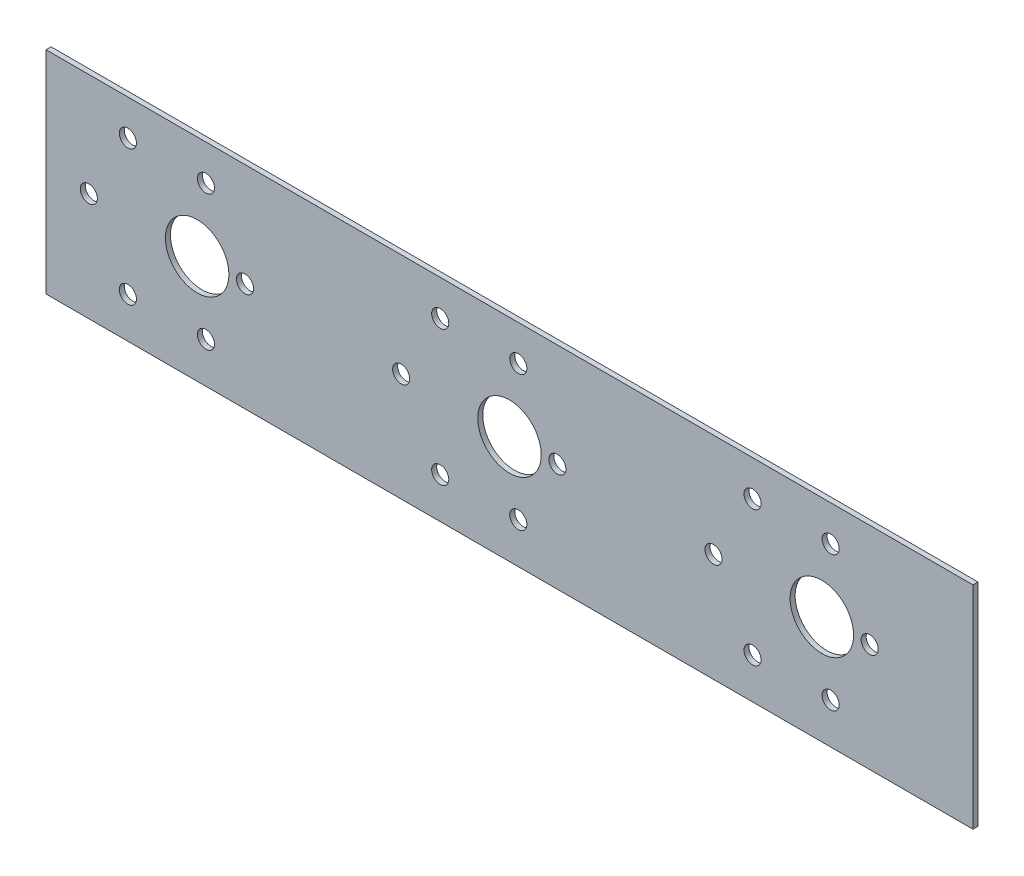
ISO-10303-21;
HEADER;
FILE_DESCRIPTION(('STEP AP214'),'2;1');
FILE_NAME('part.step','',(''),(''),'','','');
FILE_SCHEMA(('AUTOMOTIVE_DESIGN { 1 0 10303 214 1 1 1 1 }'));
ENDSEC;
DATA;
#1=APPLICATION_CONTEXT('core data for automotive mechanical design processes');
#2=APPLICATION_PROTOCOL_DEFINITION('international standard','automotive_design',2000,#1);
#3=PRODUCT_CONTEXT('',#1,'mechanical');
#4=PRODUCT('Part','Part','',(#3));
#5=PRODUCT_RELATED_PRODUCT_CATEGORY('part','',(#4));
#6=PRODUCT_DEFINITION_FORMATION('','',#4);
#7=PRODUCT_DEFINITION_CONTEXT('part definition',#1,'design');
#8=PRODUCT_DEFINITION('design','',#6,#7);
#9=PRODUCT_DEFINITION_SHAPE('','',#8);
#10=(LENGTH_UNIT() NAMED_UNIT(*) SI_UNIT(.MILLI.,.METRE.));
#11=(NAMED_UNIT(*) PLANE_ANGLE_UNIT() SI_UNIT($,.RADIAN.));
#12=(NAMED_UNIT(*) SI_UNIT($,.STERADIAN.) SOLID_ANGLE_UNIT());
#13=UNCERTAINTY_MEASURE_WITH_UNIT(LENGTH_MEASURE(1.E-05),#10,'distance_accuracy_value','');
#14=(GEOMETRIC_REPRESENTATION_CONTEXT(3) GLOBAL_UNCERTAINTY_ASSIGNED_CONTEXT((#13)) GLOBAL_UNIT_ASSIGNED_CONTEXT((#10,
#11,#12)) REPRESENTATION_CONTEXT('',''));
#15=CARTESIAN_POINT('',(0.,0.,0.));
#16=DIRECTION('',(0.,0.,1.));
#17=DIRECTION('',(1.,0.,0.));
#18=AXIS2_PLACEMENT_3D('',#15,#16,#17);
#19=CARTESIAN_POINT('',(0.,0.,1.));
#20=DIRECTION('',(0.,0.,1.));
#21=DIRECTION('',(1.,0.,0.));
#22=AXIS2_PLACEMENT_3D('',#19,#20,#21);
#23=PLANE('',#22);
#24=CARTESIAN_POINT('',(48.25,15.076606241,1.));
#25=DIRECTION('',(0.,0.,1.));
#26=DIRECTION('',(1.,0.,0.));
#27=AXIS2_PLACEMENT_3D('',#24,#25,#26);
#28=CIRCLE('',#27,1.7);
#29=CARTESIAN_POINT('',(49.95,15.076606241,1.));
#30=VERTEX_POINT('',#29);
#31=EDGE_CURVE('E229',#30,#30,#28,.T.);
#32=ORIENTED_EDGE('',*,*,#31,.F.);
#33=EDGE_LOOP('',(#32));
#34=FACE_BOUND('',#33,.T.);
#35=CARTESIAN_POINT('',(48.25,41.923393759,1.));
#36=DIRECTION('',(0.,0.,1.));
#37=DIRECTION('',(1.,0.,0.));
#38=AXIS2_PLACEMENT_3D('',#35,#36,#37);
#39=CIRCLE('',#38,1.7);
#40=CARTESIAN_POINT('',(49.95,41.923393759,1.));
#41=VERTEX_POINT('',#40);
#42=EDGE_CURVE('E217',#41,#41,#39,.T.);
#43=ORIENTED_EDGE('',*,*,#42,.F.);
#44=EDGE_LOOP('',(#43));
#45=FACE_BOUND('',#44,.T.);
#46=CARTESIAN_POINT('',(71.5,28.5,1.));
#47=DIRECTION('',(0.,0.,1.));
#48=DIRECTION('',(1.,0.,0.));
#49=AXIS2_PLACEMENT_3D('',#46,#47,#48);
#50=CIRCLE('',#49,1.69999999999999);
#51=CARTESIAN_POINT('',(73.2,28.5,1.));
#52=VERTEX_POINT('',#51);
#53=EDGE_CURVE('E205',#52,#52,#50,.T.);
#54=ORIENTED_EDGE('',*,*,#53,.F.);
#55=EDGE_LOOP('',(#54));
#56=FACE_BOUND('',#55,.T.);
#57=CARTESIAN_POINT('',(-13.75,15.076606241,1.));
#58=DIRECTION('',(0.,0.,1.));
#59=DIRECTION('',(1.,0.,0.));
#60=AXIS2_PLACEMENT_3D('',#57,#58,#59);
#61=CIRCLE('',#60,1.7);
#62=CARTESIAN_POINT('',(-12.05,15.076606241,1.));
#63=VERTEX_POINT('',#62);
#64=EDGE_CURVE('E193',#63,#63,#61,.T.);
#65=ORIENTED_EDGE('',*,*,#64,.F.);
#66=EDGE_LOOP('',(#65));
#67=FACE_BOUND('',#66,.T.);
#68=CARTESIAN_POINT('',(-13.75,41.923393759,1.));
#69=DIRECTION('',(0.,0.,1.));
#70=DIRECTION('',(1.,0.,0.));
#71=AXIS2_PLACEMENT_3D('',#68,#69,#70);
#72=CIRCLE('',#71,1.7);
#73=CARTESIAN_POINT('',(-12.05,41.923393759,1.));
#74=VERTEX_POINT('',#73);
#75=EDGE_CURVE('E181',#74,#74,#72,.T.);
#76=ORIENTED_EDGE('',*,*,#75,.F.);
#77=EDGE_LOOP('',(#76));
#78=FACE_BOUND('',#77,.T.);
#79=CARTESIAN_POINT('',(9.5,28.5,1.));
#80=DIRECTION('',(0.,0.,1.));
#81=DIRECTION('',(1.,0.,0.));
#82=AXIS2_PLACEMENT_3D('',#79,#80,#81);
#83=CIRCLE('',#82,1.7);
#84=CARTESIAN_POINT('',(11.2,28.5,1.));
#85=VERTEX_POINT('',#84);
#86=EDGE_CURVE('E169',#85,#85,#83,.T.);
#87=ORIENTED_EDGE('',*,*,#86,.F.);
#88=EDGE_LOOP('',(#87));
#89=FACE_BOUND('',#88,.T.);
#90=CARTESIAN_POINT('',(-75.75,15.076606241,1.));
#91=DIRECTION('',(0.,0.,1.));
#92=DIRECTION('',(1.,0.,0.));
#93=AXIS2_PLACEMENT_3D('',#90,#91,#92);
#94=CIRCLE('',#93,1.69999999999999);
#95=CARTESIAN_POINT('',(-74.05,15.076606241,1.));
#96=VERTEX_POINT('',#95);
#97=EDGE_CURVE('E157',#96,#96,#94,.T.);
#98=ORIENTED_EDGE('',*,*,#97,.F.);
#99=EDGE_LOOP('',(#98));
#100=FACE_BOUND('',#99,.T.);
#101=CARTESIAN_POINT('',(-75.75,41.923393759,1.));
#102=DIRECTION('',(0.,0.,1.));
#103=DIRECTION('',(1.,0.,0.));
#104=AXIS2_PLACEMENT_3D('',#101,#102,#103);
#105=CIRCLE('',#104,1.69999999999999);
#106=CARTESIAN_POINT('',(-74.05,41.923393759,1.));
#107=VERTEX_POINT('',#106);
#108=EDGE_CURVE('E145',#107,#107,#105,.T.);
#109=ORIENTED_EDGE('',*,*,#108,.F.);
#110=EDGE_LOOP('',(#109));
#111=FACE_BOUND('',#110,.T.);
#112=CARTESIAN_POINT('',(-52.5,28.5,1.));
#113=DIRECTION('',(0.,0.,1.));
#114=DIRECTION('',(1.,0.,0.));
#115=AXIS2_PLACEMENT_3D('',#112,#113,#114);
#116=CIRCLE('',#115,1.7);
#117=CARTESIAN_POINT('',(-50.8,28.5,1.));
#118=VERTEX_POINT('',#117);
#119=EDGE_CURVE('E133',#118,#118,#116,.T.);
#120=ORIENTED_EDGE('',*,*,#119,.F.);
#121=EDGE_LOOP('',(#120));
#122=FACE_BOUND('',#121,.T.);
#123=CARTESIAN_POINT('',(0.,28.5,1.));
#124=DIRECTION('',(0.,0.,1.));
#125=DIRECTION('',(1.,0.,0.));
#126=AXIS2_PLACEMENT_3D('',#123,#124,#125);
#127=CIRCLE('',#126,6.3);
#128=CARTESIAN_POINT('',(6.3,28.5,1.));
#129=VERTEX_POINT('',#128);
#130=EDGE_CURVE('E121',#129,#129,#127,.T.);
#131=ORIENTED_EDGE('',*,*,#130,.F.);
#132=EDGE_LOOP('',(#131));
#133=FACE_BOUND('',#132,.T.);
#134=DIRECTION('',(0.,-1.,0.));
#135=VECTOR('',#134,1.);
#136=CARTESIAN_POINT('',(-92.,49.,1.));
#137=LINE('',#136,#135);
#138=CARTESIAN_POINT('',(-92.,49.,1.));
#139=VERTEX_POINT('',#138);
#140=CARTESIAN_POINT('',(-92.,7.,1.));
#141=VERTEX_POINT('',#140);
#142=EDGE_CURVE('E91',#139,#141,#137,.T.);
#143=ORIENTED_EDGE('',*,*,#142,.T.);
#144=DIRECTION('',(1.,0.,0.));
#145=VECTOR('',#144,1.);
#146=CARTESIAN_POINT('',(-92.,7.,1.));
#147=LINE('',#146,#145);
#148=CARTESIAN_POINT('',(92.,7.,1.));
#149=VERTEX_POINT('',#148);
#150=EDGE_CURVE('E86',#141,#149,#147,.T.);
#151=ORIENTED_EDGE('',*,*,#150,.T.);
#152=DIRECTION('',(0.,1.,0.));
#153=VECTOR('',#152,1.);
#154=CARTESIAN_POINT('',(92.,7.,1.));
#155=LINE('',#154,#153);
#156=CARTESIAN_POINT('',(92.,49.,1.));
#157=VERTEX_POINT('',#156);
#158=EDGE_CURVE('E89',#149,#157,#155,.T.);
#159=ORIENTED_EDGE('',*,*,#158,.T.);
#160=DIRECTION('',(-1.,0.,0.));
#161=VECTOR('',#160,1.);
#162=CARTESIAN_POINT('',(92.,49.,1.));
#163=LINE('',#162,#161);
#164=EDGE_CURVE('E56',#157,#139,#163,.T.);
#165=ORIENTED_EDGE('',*,*,#164,.T.);
#166=EDGE_LOOP('',(#143,#151,#159,#165));
#167=FACE_BOUND('',#166,.T.);
#168=CARTESIAN_POINT('',(-62.,28.5,1.));
#169=DIRECTION('',(0.,0.,1.));
#170=DIRECTION('',(1.,0.,0.));
#171=AXIS2_PLACEMENT_3D('',#168,#169,#170);
#172=CIRCLE('',#171,6.3);
#173=CARTESIAN_POINT('',(-55.7,28.5,1.));
#174=VERTEX_POINT('',#173);
#175=EDGE_CURVE('E106',#174,#174,#172,.T.);
#176=ORIENTED_EDGE('',*,*,#175,.F.);
#177=EDGE_LOOP('',(#176));
#178=FACE_BOUND('',#177,.T.);
#179=CARTESIAN_POINT('',(62.,28.5,1.));
#180=DIRECTION('',(0.,0.,1.));
#181=DIRECTION('',(1.,0.,0.));
#182=AXIS2_PLACEMENT_3D('',#179,#180,#181);
#183=CIRCLE('',#182,6.3);
#184=CARTESIAN_POINT('',(68.3,28.5,1.));
#185=VERTEX_POINT('',#184);
#186=EDGE_CURVE('E127',#185,#185,#183,.T.);
#187=ORIENTED_EDGE('',*,*,#186,.F.);
#188=EDGE_LOOP('',(#187));
#189=FACE_BOUND('',#188,.T.);
#190=CARTESIAN_POINT('',(-60.25,41.923393759,1.));
#191=DIRECTION('',(0.,0.,1.));
#192=DIRECTION('',(1.,0.,0.));
#193=AXIS2_PLACEMENT_3D('',#190,#191,#192);
#194=CIRCLE('',#193,1.7);
#195=CARTESIAN_POINT('',(-58.55,41.923393759,1.));
#196=VERTEX_POINT('',#195);
#197=EDGE_CURVE('E139',#196,#196,#194,.T.);
#198=ORIENTED_EDGE('',*,*,#197,.F.);
#199=EDGE_LOOP('',(#198));
#200=FACE_BOUND('',#199,.T.);
#201=CARTESIAN_POINT('',(-83.5,28.5,1.));
#202=DIRECTION('',(0.,0.,1.));
#203=DIRECTION('',(1.,0.,0.));
#204=AXIS2_PLACEMENT_3D('',#201,#202,#203);
#205=CIRCLE('',#204,1.69999999999999);
#206=CARTESIAN_POINT('',(-81.8,28.5,1.));
#207=VERTEX_POINT('',#206);
#208=EDGE_CURVE('E151',#207,#207,#205,.T.);
#209=ORIENTED_EDGE('',*,*,#208,.F.);
#210=EDGE_LOOP('',(#209));
#211=FACE_BOUND('',#210,.T.);
#212=CARTESIAN_POINT('',(-60.25,15.076606241,1.));
#213=DIRECTION('',(0.,0.,1.));
#214=DIRECTION('',(1.,0.,0.));
#215=AXIS2_PLACEMENT_3D('',#212,#213,#214);
#216=CIRCLE('',#215,1.7);
#217=CARTESIAN_POINT('',(-58.55,15.076606241,1.));
#218=VERTEX_POINT('',#217);
#219=EDGE_CURVE('E163',#218,#218,#216,.T.);
#220=ORIENTED_EDGE('',*,*,#219,.F.);
#221=EDGE_LOOP('',(#220));
#222=FACE_BOUND('',#221,.T.);
#223=CARTESIAN_POINT('',(1.75,41.923393759,1.));
#224=DIRECTION('',(0.,0.,1.));
#225=DIRECTION('',(1.,0.,0.));
#226=AXIS2_PLACEMENT_3D('',#223,#224,#225);
#227=CIRCLE('',#226,1.7);
#228=CARTESIAN_POINT('',(3.45,41.923393759,1.));
#229=VERTEX_POINT('',#228);
#230=EDGE_CURVE('E175',#229,#229,#227,.T.);
#231=ORIENTED_EDGE('',*,*,#230,.F.);
#232=EDGE_LOOP('',(#231));
#233=FACE_BOUND('',#232,.T.);
#234=CARTESIAN_POINT('',(-21.5,28.5,1.));
#235=DIRECTION('',(0.,0.,1.));
#236=DIRECTION('',(1.,0.,0.));
#237=AXIS2_PLACEMENT_3D('',#234,#235,#236);
#238=CIRCLE('',#237,1.7);
#239=CARTESIAN_POINT('',(-19.8,28.5,1.));
#240=VERTEX_POINT('',#239);
#241=EDGE_CURVE('E187',#240,#240,#238,.T.);
#242=ORIENTED_EDGE('',*,*,#241,.F.);
#243=EDGE_LOOP('',(#242));
#244=FACE_BOUND('',#243,.T.);
#245=CARTESIAN_POINT('',(1.75,15.076606241,1.));
#246=DIRECTION('',(0.,0.,1.));
#247=DIRECTION('',(1.,0.,0.));
#248=AXIS2_PLACEMENT_3D('',#245,#246,#247);
#249=CIRCLE('',#248,1.7);
#250=CARTESIAN_POINT('',(3.45,15.076606241,1.));
#251=VERTEX_POINT('',#250);
#252=EDGE_CURVE('E199',#251,#251,#249,.T.);
#253=ORIENTED_EDGE('',*,*,#252,.F.);
#254=EDGE_LOOP('',(#253));
#255=FACE_BOUND('',#254,.T.);
#256=CARTESIAN_POINT('',(63.75,41.923393759,1.));
#257=DIRECTION('',(0.,0.,1.));
#258=DIRECTION('',(1.,0.,0.));
#259=AXIS2_PLACEMENT_3D('',#256,#257,#258);
#260=CIRCLE('',#259,1.69999999999999);
#261=CARTESIAN_POINT('',(65.45,41.923393759,1.));
#262=VERTEX_POINT('',#261);
#263=EDGE_CURVE('E211',#262,#262,#260,.T.);
#264=ORIENTED_EDGE('',*,*,#263,.F.);
#265=EDGE_LOOP('',(#264));
#266=FACE_BOUND('',#265,.T.);
#267=CARTESIAN_POINT('',(40.5,28.5,1.));
#268=DIRECTION('',(0.,0.,1.));
#269=DIRECTION('',(1.,0.,0.));
#270=AXIS2_PLACEMENT_3D('',#267,#268,#269);
#271=CIRCLE('',#270,1.7);
#272=CARTESIAN_POINT('',(42.2,28.5,1.));
#273=VERTEX_POINT('',#272);
#274=EDGE_CURVE('E223',#273,#273,#271,.T.);
#275=ORIENTED_EDGE('',*,*,#274,.F.);
#276=EDGE_LOOP('',(#275));
#277=FACE_BOUND('',#276,.T.);
#278=CARTESIAN_POINT('',(63.75,15.076606241,1.));
#279=DIRECTION('',(0.,0.,1.));
#280=DIRECTION('',(1.,0.,0.));
#281=AXIS2_PLACEMENT_3D('',#278,#279,#280);
#282=CIRCLE('',#281,1.69999999999999);
#283=CARTESIAN_POINT('',(65.45,15.076606241,1.));
#284=VERTEX_POINT('',#283);
#285=EDGE_CURVE('E235',#284,#284,#282,.T.);
#286=ORIENTED_EDGE('',*,*,#285,.F.);
#287=EDGE_LOOP('',(#286));
#288=FACE_BOUND('',#287,.T.);
#289=ADVANCED_FACE('F39',(#34,#45,#56,#67,#78,#89,#100,#111,#122,#133,#167,#178,#189,#200,#211,
#222,#233,#244,#255,#266,#277,#288),#23,.T.);
#290=CARTESIAN_POINT('',(0.,0.,0.));
#291=DIRECTION('',(0.,0.,1.));
#292=DIRECTION('',(1.,0.,0.));
#293=AXIS2_PLACEMENT_3D('',#290,#291,#292);
#294=PLANE('',#293);
#295=DIRECTION('',(0.,-1.,0.));
#296=VECTOR('',#295,1.);
#297=CARTESIAN_POINT('',(-92.,49.,0.));
#298=LINE('',#297,#296);
#299=CARTESIAN_POINT('',(-92.,49.,0.));
#300=VERTEX_POINT('',#299);
#301=CARTESIAN_POINT('',(-92.,7.,0.));
#302=VERTEX_POINT('',#301);
#303=EDGE_CURVE('E103',#300,#302,#298,.T.);
#304=ORIENTED_EDGE('',*,*,#303,.F.);
#305=DIRECTION('',(-1.,0.,0.));
#306=VECTOR('',#305,1.);
#307=CARTESIAN_POINT('',(92.,49.,0.));
#308=LINE('',#307,#306);
#309=CARTESIAN_POINT('',(92.,49.,0.));
#310=VERTEX_POINT('',#309);
#311=EDGE_CURVE('E79',#310,#300,#308,.T.);
#312=ORIENTED_EDGE('',*,*,#311,.F.);
#313=DIRECTION('',(0.,1.,0.));
#314=VECTOR('',#313,1.);
#315=CARTESIAN_POINT('',(92.,7.,0.));
#316=LINE('',#315,#314);
#317=CARTESIAN_POINT('',(92.,7.,0.));
#318=VERTEX_POINT('',#317);
#319=EDGE_CURVE('E73',#318,#310,#316,.T.);
#320=ORIENTED_EDGE('',*,*,#319,.F.);
#321=DIRECTION('',(1.,0.,0.));
#322=VECTOR('',#321,1.);
#323=CARTESIAN_POINT('',(-92.,7.,0.));
#324=LINE('',#323,#322);
#325=EDGE_CURVE('E95',#302,#318,#324,.T.);
#326=ORIENTED_EDGE('',*,*,#325,.F.);
#327=EDGE_LOOP('',(#304,#312,#320,#326));
#328=FACE_BOUND('',#327,.T.);
#329=CARTESIAN_POINT('',(-62.,28.5,0.));
#330=DIRECTION('',(0.,0.,1.));
#331=DIRECTION('',(1.,0.,0.));
#332=AXIS2_PLACEMENT_3D('',#329,#330,#331);
#333=CIRCLE('',#332,6.3);
#334=CARTESIAN_POINT('',(-55.7,28.5,0.));
#335=VERTEX_POINT('',#334);
#336=EDGE_CURVE('E118',#335,#335,#333,.T.);
#337=ORIENTED_EDGE('',*,*,#336,.T.);
#338=EDGE_LOOP('',(#337));
#339=FACE_BOUND('',#338,.T.);
#340=CARTESIAN_POINT('',(0.,28.5,0.));
#341=DIRECTION('',(0.,0.,1.));
#342=DIRECTION('',(1.,0.,0.));
#343=AXIS2_PLACEMENT_3D('',#340,#341,#342);
#344=CIRCLE('',#343,6.3);
#345=CARTESIAN_POINT('',(6.3,28.5,0.));
#346=VERTEX_POINT('',#345);
#347=EDGE_CURVE('E124',#346,#346,#344,.T.);
#348=ORIENTED_EDGE('',*,*,#347,.T.);
#349=EDGE_LOOP('',(#348));
#350=FACE_BOUND('',#349,.T.);
#351=CARTESIAN_POINT('',(62.,28.5,0.));
#352=DIRECTION('',(0.,0.,1.));
#353=DIRECTION('',(1.,0.,0.));
#354=AXIS2_PLACEMENT_3D('',#351,#352,#353);
#355=CIRCLE('',#354,6.3);
#356=CARTESIAN_POINT('',(68.3,28.5,0.));
#357=VERTEX_POINT('',#356);
#358=EDGE_CURVE('E130',#357,#357,#355,.T.);
#359=ORIENTED_EDGE('',*,*,#358,.T.);
#360=EDGE_LOOP('',(#359));
#361=FACE_BOUND('',#360,.T.);
#362=CARTESIAN_POINT('',(-52.5,28.5,0.));
#363=DIRECTION('',(0.,0.,1.));
#364=DIRECTION('',(1.,0.,0.));
#365=AXIS2_PLACEMENT_3D('',#362,#363,#364);
#366=CIRCLE('',#365,1.7);
#367=CARTESIAN_POINT('',(-50.8,28.5,0.));
#368=VERTEX_POINT('',#367);
#369=EDGE_CURVE('E136',#368,#368,#366,.T.);
#370=ORIENTED_EDGE('',*,*,#369,.T.);
#371=EDGE_LOOP('',(#370));
#372=FACE_BOUND('',#371,.T.);
#373=CARTESIAN_POINT('',(-60.25,41.923393759,0.));
#374=DIRECTION('',(0.,0.,1.));
#375=DIRECTION('',(1.,0.,0.));
#376=AXIS2_PLACEMENT_3D('',#373,#374,#375);
#377=CIRCLE('',#376,1.7);
#378=CARTESIAN_POINT('',(-58.55,41.923393759,0.));
#379=VERTEX_POINT('',#378);
#380=EDGE_CURVE('E142',#379,#379,#377,.T.);
#381=ORIENTED_EDGE('',*,*,#380,.T.);
#382=EDGE_LOOP('',(#381));
#383=FACE_BOUND('',#382,.T.);
#384=CARTESIAN_POINT('',(-75.75,41.923393759,0.));
#385=DIRECTION('',(0.,0.,1.));
#386=DIRECTION('',(1.,0.,0.));
#387=AXIS2_PLACEMENT_3D('',#384,#385,#386);
#388=CIRCLE('',#387,1.69999999999999);
#389=CARTESIAN_POINT('',(-74.05,41.923393759,0.));
#390=VERTEX_POINT('',#389);
#391=EDGE_CURVE('E148',#390,#390,#388,.T.);
#392=ORIENTED_EDGE('',*,*,#391,.T.);
#393=EDGE_LOOP('',(#392));
#394=FACE_BOUND('',#393,.T.);
#395=CARTESIAN_POINT('',(-83.5,28.5,0.));
#396=DIRECTION('',(0.,0.,1.));
#397=DIRECTION('',(1.,0.,0.));
#398=AXIS2_PLACEMENT_3D('',#395,#396,#397);
#399=CIRCLE('',#398,1.69999999999999);
#400=CARTESIAN_POINT('',(-81.8,28.5,0.));
#401=VERTEX_POINT('',#400);
#402=EDGE_CURVE('E154',#401,#401,#399,.T.);
#403=ORIENTED_EDGE('',*,*,#402,.T.);
#404=EDGE_LOOP('',(#403));
#405=FACE_BOUND('',#404,.T.);
#406=CARTESIAN_POINT('',(-75.75,15.076606241,0.));
#407=DIRECTION('',(0.,0.,1.));
#408=DIRECTION('',(1.,0.,0.));
#409=AXIS2_PLACEMENT_3D('',#406,#407,#408);
#410=CIRCLE('',#409,1.69999999999999);
#411=CARTESIAN_POINT('',(-74.05,15.076606241,0.));
#412=VERTEX_POINT('',#411);
#413=EDGE_CURVE('E160',#412,#412,#410,.T.);
#414=ORIENTED_EDGE('',*,*,#413,.T.);
#415=EDGE_LOOP('',(#414));
#416=FACE_BOUND('',#415,.T.);
#417=CARTESIAN_POINT('',(-60.25,15.076606241,0.));
#418=DIRECTION('',(0.,0.,1.));
#419=DIRECTION('',(1.,0.,0.));
#420=AXIS2_PLACEMENT_3D('',#417,#418,#419);
#421=CIRCLE('',#420,1.7);
#422=CARTESIAN_POINT('',(-58.55,15.076606241,0.));
#423=VERTEX_POINT('',#422);
#424=EDGE_CURVE('E166',#423,#423,#421,.T.);
#425=ORIENTED_EDGE('',*,*,#424,.T.);
#426=EDGE_LOOP('',(#425));
#427=FACE_BOUND('',#426,.T.);
#428=CARTESIAN_POINT('',(9.5,28.5,0.));
#429=DIRECTION('',(0.,0.,1.));
#430=DIRECTION('',(1.,0.,0.));
#431=AXIS2_PLACEMENT_3D('',#428,#429,#430);
#432=CIRCLE('',#431,1.7);
#433=CARTESIAN_POINT('',(11.2,28.5,0.));
#434=VERTEX_POINT('',#433);
#435=EDGE_CURVE('E172',#434,#434,#432,.T.);
#436=ORIENTED_EDGE('',*,*,#435,.T.);
#437=EDGE_LOOP('',(#436));
#438=FACE_BOUND('',#437,.T.);
#439=CARTESIAN_POINT('',(1.75,41.923393759,0.));
#440=DIRECTION('',(0.,0.,1.));
#441=DIRECTION('',(1.,0.,0.));
#442=AXIS2_PLACEMENT_3D('',#439,#440,#441);
#443=CIRCLE('',#442,1.7);
#444=CARTESIAN_POINT('',(3.45,41.923393759,0.));
#445=VERTEX_POINT('',#444);
#446=EDGE_CURVE('E178',#445,#445,#443,.T.);
#447=ORIENTED_EDGE('',*,*,#446,.T.);
#448=EDGE_LOOP('',(#447));
#449=FACE_BOUND('',#448,.T.);
#450=CARTESIAN_POINT('',(-13.75,41.923393759,0.));
#451=DIRECTION('',(0.,0.,1.));
#452=DIRECTION('',(1.,0.,0.));
#453=AXIS2_PLACEMENT_3D('',#450,#451,#452);
#454=CIRCLE('',#453,1.7);
#455=CARTESIAN_POINT('',(-12.05,41.923393759,0.));
#456=VERTEX_POINT('',#455);
#457=EDGE_CURVE('E184',#456,#456,#454,.T.);
#458=ORIENTED_EDGE('',*,*,#457,.T.);
#459=EDGE_LOOP('',(#458));
#460=FACE_BOUND('',#459,.T.);
#461=CARTESIAN_POINT('',(-21.5,28.5,0.));
#462=DIRECTION('',(0.,0.,1.));
#463=DIRECTION('',(1.,0.,0.));
#464=AXIS2_PLACEMENT_3D('',#461,#462,#463);
#465=CIRCLE('',#464,1.7);
#466=CARTESIAN_POINT('',(-19.8,28.5,0.));
#467=VERTEX_POINT('',#466);
#468=EDGE_CURVE('E190',#467,#467,#465,.T.);
#469=ORIENTED_EDGE('',*,*,#468,.T.);
#470=EDGE_LOOP('',(#469));
#471=FACE_BOUND('',#470,.T.);
#472=CARTESIAN_POINT('',(-13.75,15.076606241,0.));
#473=DIRECTION('',(0.,0.,1.));
#474=DIRECTION('',(1.,0.,0.));
#475=AXIS2_PLACEMENT_3D('',#472,#473,#474);
#476=CIRCLE('',#475,1.7);
#477=CARTESIAN_POINT('',(-12.05,15.076606241,0.));
#478=VERTEX_POINT('',#477);
#479=EDGE_CURVE('E196',#478,#478,#476,.T.);
#480=ORIENTED_EDGE('',*,*,#479,.T.);
#481=EDGE_LOOP('',(#480));
#482=FACE_BOUND('',#481,.T.);
#483=CARTESIAN_POINT('',(1.75,15.076606241,0.));
#484=DIRECTION('',(0.,0.,1.));
#485=DIRECTION('',(1.,0.,0.));
#486=AXIS2_PLACEMENT_3D('',#483,#484,#485);
#487=CIRCLE('',#486,1.7);
#488=CARTESIAN_POINT('',(3.45,15.076606241,0.));
#489=VERTEX_POINT('',#488);
#490=EDGE_CURVE('E202',#489,#489,#487,.T.);
#491=ORIENTED_EDGE('',*,*,#490,.T.);
#492=EDGE_LOOP('',(#491));
#493=FACE_BOUND('',#492,.T.);
#494=CARTESIAN_POINT('',(71.5,28.5,0.));
#495=DIRECTION('',(0.,0.,1.));
#496=DIRECTION('',(1.,0.,0.));
#497=AXIS2_PLACEMENT_3D('',#494,#495,#496);
#498=CIRCLE('',#497,1.69999999999999);
#499=CARTESIAN_POINT('',(73.2,28.5,0.));
#500=VERTEX_POINT('',#499);
#501=EDGE_CURVE('E208',#500,#500,#498,.T.);
#502=ORIENTED_EDGE('',*,*,#501,.T.);
#503=EDGE_LOOP('',(#502));
#504=FACE_BOUND('',#503,.T.);
#505=CARTESIAN_POINT('',(63.75,41.923393759,0.));
#506=DIRECTION('',(0.,0.,1.));
#507=DIRECTION('',(1.,0.,0.));
#508=AXIS2_PLACEMENT_3D('',#505,#506,#507);
#509=CIRCLE('',#508,1.69999999999999);
#510=CARTESIAN_POINT('',(65.45,41.923393759,0.));
#511=VERTEX_POINT('',#510);
#512=EDGE_CURVE('E214',#511,#511,#509,.T.);
#513=ORIENTED_EDGE('',*,*,#512,.T.);
#514=EDGE_LOOP('',(#513));
#515=FACE_BOUND('',#514,.T.);
#516=CARTESIAN_POINT('',(48.25,41.923393759,0.));
#517=DIRECTION('',(0.,0.,1.));
#518=DIRECTION('',(1.,0.,0.));
#519=AXIS2_PLACEMENT_3D('',#516,#517,#518);
#520=CIRCLE('',#519,1.7);
#521=CARTESIAN_POINT('',(49.95,41.923393759,0.));
#522=VERTEX_POINT('',#521);
#523=EDGE_CURVE('E220',#522,#522,#520,.T.);
#524=ORIENTED_EDGE('',*,*,#523,.T.);
#525=EDGE_LOOP('',(#524));
#526=FACE_BOUND('',#525,.T.);
#527=CARTESIAN_POINT('',(40.5,28.5,0.));
#528=DIRECTION('',(0.,0.,1.));
#529=DIRECTION('',(1.,0.,0.));
#530=AXIS2_PLACEMENT_3D('',#527,#528,#529);
#531=CIRCLE('',#530,1.7);
#532=CARTESIAN_POINT('',(42.2,28.5,0.));
#533=VERTEX_POINT('',#532);
#534=EDGE_CURVE('E226',#533,#533,#531,.T.);
#535=ORIENTED_EDGE('',*,*,#534,.T.);
#536=EDGE_LOOP('',(#535));
#537=FACE_BOUND('',#536,.T.);
#538=CARTESIAN_POINT('',(48.25,15.076606241,0.));
#539=DIRECTION('',(0.,0.,1.));
#540=DIRECTION('',(1.,0.,0.));
#541=AXIS2_PLACEMENT_3D('',#538,#539,#540);
#542=CIRCLE('',#541,1.7);
#543=CARTESIAN_POINT('',(49.95,15.076606241,0.));
#544=VERTEX_POINT('',#543);
#545=EDGE_CURVE('E232',#544,#544,#542,.T.);
#546=ORIENTED_EDGE('',*,*,#545,.T.);
#547=EDGE_LOOP('',(#546));
#548=FACE_BOUND('',#547,.T.);
#549=CARTESIAN_POINT('',(63.75,15.076606241,0.));
#550=DIRECTION('',(0.,0.,1.));
#551=DIRECTION('',(1.,0.,0.));
#552=AXIS2_PLACEMENT_3D('',#549,#550,#551);
#553=CIRCLE('',#552,1.69999999999999);
#554=CARTESIAN_POINT('',(65.45,15.076606241,0.));
#555=VERTEX_POINT('',#554);
#556=EDGE_CURVE('E238',#555,#555,#553,.T.);
#557=ORIENTED_EDGE('',*,*,#556,.T.);
#558=EDGE_LOOP('',(#557));
#559=FACE_BOUND('',#558,.T.);
#560=ADVANCED_FACE('F114',(#328,#339,#350,#361,#372,#383,#394,#405,#416,#427,#438,#449,#460,
#471,#482,#493,#504,#515,#526,#537,#548,#559),#294,.F.);
#561=CARTESIAN_POINT('',(-92.,49.,1.));
#562=DIRECTION('',(1.,0.,0.));
#563=DIRECTION('',(0.,0.,-1.));
#564=AXIS2_PLACEMENT_3D('',#561,#562,#563);
#565=PLANE('',#564);
#566=ORIENTED_EDGE('',*,*,#303,.T.);
#567=DIRECTION('',(0.,0.,-1.));
#568=VECTOR('',#567,1.);
#569=CARTESIAN_POINT('',(-92.,7.,1.));
#570=LINE('',#569,#568);
#571=EDGE_CURVE('E11',#141,#302,#570,.T.);
#572=ORIENTED_EDGE('',*,*,#571,.F.);
#573=ORIENTED_EDGE('',*,*,#142,.F.);
#574=DIRECTION('',(0.,0.,-1.));
#575=VECTOR('',#574,1.);
#576=CARTESIAN_POINT('',(-92.,49.,1.));
#577=LINE('',#576,#575);
#578=EDGE_CURVE('E99',#139,#300,#577,.T.);
#579=ORIENTED_EDGE('',*,*,#578,.T.);
#580=EDGE_LOOP('',(#566,#572,#573,#579));
#581=FACE_BOUND('',#580,.T.);
#582=ADVANCED_FACE('F41',(#581),#565,.F.);
#583=CARTESIAN_POINT('',(-92.,7.,1.));
#584=DIRECTION('',(0.,1.,0.));
#585=DIRECTION('',(0.,0.,1.));
#586=AXIS2_PLACEMENT_3D('',#583,#584,#585);
#587=PLANE('',#586);
#588=ORIENTED_EDGE('',*,*,#325,.T.);
#589=DIRECTION('',(0.,0.,-1.));
#590=VECTOR('',#589,1.);
#591=CARTESIAN_POINT('',(92.,7.,1.));
#592=LINE('',#591,#590);
#593=EDGE_CURVE('E48',#149,#318,#592,.T.);
#594=ORIENTED_EDGE('',*,*,#593,.F.);
#595=ORIENTED_EDGE('',*,*,#150,.F.);
#596=ORIENTED_EDGE('',*,*,#571,.T.);
#597=EDGE_LOOP('',(#588,#594,#595,#596));
#598=FACE_BOUND('',#597,.T.);
#599=ADVANCED_FACE('F94',(#598),#587,.F.);
#600=CARTESIAN_POINT('',(92.,7.,1.));
#601=DIRECTION('',(-1.,0.,0.));
#602=DIRECTION('',(0.,0.,1.));
#603=AXIS2_PLACEMENT_3D('',#600,#601,#602);
#604=PLANE('',#603);
#605=ORIENTED_EDGE('',*,*,#319,.T.);
#606=DIRECTION('',(0.,0.,-1.));
#607=VECTOR('',#606,1.);
#608=CARTESIAN_POINT('',(92.,49.,1.));
#609=LINE('',#608,#607);
#610=EDGE_CURVE('E96',#157,#310,#609,.T.);
#611=ORIENTED_EDGE('',*,*,#610,.F.);
#612=ORIENTED_EDGE('',*,*,#158,.F.);
#613=ORIENTED_EDGE('',*,*,#593,.T.);
#614=EDGE_LOOP('',(#605,#611,#612,#613));
#615=FACE_BOUND('',#614,.T.);
#616=ADVANCED_FACE('F97',(#615),#604,.F.);
#617=CARTESIAN_POINT('',(92.,49.,1.));
#618=DIRECTION('',(0.,-1.,0.));
#619=DIRECTION('',(0.,0.,-1.));
#620=AXIS2_PLACEMENT_3D('',#617,#618,#619);
#621=PLANE('',#620);
#622=ORIENTED_EDGE('',*,*,#311,.T.);
#623=ORIENTED_EDGE('',*,*,#578,.F.);
#624=ORIENTED_EDGE('',*,*,#164,.F.);
#625=ORIENTED_EDGE('',*,*,#610,.T.);
#626=EDGE_LOOP('',(#622,#623,#624,#625));
#627=FACE_BOUND('',#626,.T.);
#628=ADVANCED_FACE('F111',(#627),#621,.F.);
#629=CARTESIAN_POINT('',(-62.,28.5,1.));
#630=DIRECTION('',(0.,0.,-1.));
#631=DIRECTION('',(-1.,0.,0.));
#632=AXIS2_PLACEMENT_3D('',#629,#630,#631);
#633=CYLINDRICAL_SURFACE('',#632,6.3);
#634=ORIENTED_EDGE('',*,*,#175,.T.);
#635=EDGE_LOOP('',(#634));
#636=FACE_BOUND('',#635,.T.);
#637=ORIENTED_EDGE('',*,*,#336,.F.);
#638=EDGE_LOOP('',(#637));
#639=FACE_BOUND('',#638,.T.);
#640=ADVANCED_FACE('F257',(#636,#639),#633,.F.);
#641=CARTESIAN_POINT('',(0.,28.5,1.));
#642=DIRECTION('',(0.,0.,-1.));
#643=DIRECTION('',(-1.,0.,0.));
#644=AXIS2_PLACEMENT_3D('',#641,#642,#643);
#645=CYLINDRICAL_SURFACE('',#644,6.3);
#646=ORIENTED_EDGE('',*,*,#130,.T.);
#647=EDGE_LOOP('',(#646));
#648=FACE_BOUND('',#647,.T.);
#649=ORIENTED_EDGE('',*,*,#347,.F.);
#650=EDGE_LOOP('',(#649));
#651=FACE_BOUND('',#650,.T.);
#652=ADVANCED_FACE('F302',(#648,#651),#645,.F.);
#653=CARTESIAN_POINT('',(62.,28.5,1.));
#654=DIRECTION('',(0.,0.,-1.));
#655=DIRECTION('',(-1.,0.,0.));
#656=AXIS2_PLACEMENT_3D('',#653,#654,#655);
#657=CYLINDRICAL_SURFACE('',#656,6.3);
#658=ORIENTED_EDGE('',*,*,#186,.T.);
#659=EDGE_LOOP('',(#658));
#660=FACE_BOUND('',#659,.T.);
#661=ORIENTED_EDGE('',*,*,#358,.F.);
#662=EDGE_LOOP('',(#661));
#663=FACE_BOUND('',#662,.T.);
#664=ADVANCED_FACE('F310',(#660,#663),#657,.F.);
#665=CARTESIAN_POINT('',(-52.5,28.5,1.));
#666=DIRECTION('',(0.,0.,-1.));
#667=DIRECTION('',(-1.,0.,0.));
#668=AXIS2_PLACEMENT_3D('',#665,#666,#667);
#669=CYLINDRICAL_SURFACE('',#668,1.7);
#670=ORIENTED_EDGE('',*,*,#119,.T.);
#671=EDGE_LOOP('',(#670));
#672=FACE_BOUND('',#671,.T.);
#673=ORIENTED_EDGE('',*,*,#369,.F.);
#674=EDGE_LOOP('',(#673));
#675=FACE_BOUND('',#674,.T.);
#676=ADVANCED_FACE('F318',(#672,#675),#669,.F.);
#677=CARTESIAN_POINT('',(-60.25,41.923393759,1.));
#678=DIRECTION('',(0.,0.,-1.));
#679=DIRECTION('',(-1.,0.,0.));
#680=AXIS2_PLACEMENT_3D('',#677,#678,#679);
#681=CYLINDRICAL_SURFACE('',#680,1.7);
#682=ORIENTED_EDGE('',*,*,#197,.T.);
#683=EDGE_LOOP('',(#682));
#684=FACE_BOUND('',#683,.T.);
#685=ORIENTED_EDGE('',*,*,#380,.F.);
#686=EDGE_LOOP('',(#685));
#687=FACE_BOUND('',#686,.T.);
#688=ADVANCED_FACE('F327',(#684,#687),#681,.F.);
#689=CARTESIAN_POINT('',(-75.75,41.923393759,1.));
#690=DIRECTION('',(0.,0.,-1.));
#691=DIRECTION('',(-1.,0.,0.));
#692=AXIS2_PLACEMENT_3D('',#689,#690,#691);
#693=CYLINDRICAL_SURFACE('',#692,1.69999999999999);
#694=ORIENTED_EDGE('',*,*,#108,.T.);
#695=EDGE_LOOP('',(#694));
#696=FACE_BOUND('',#695,.T.);
#697=ORIENTED_EDGE('',*,*,#391,.F.);
#698=EDGE_LOOP('',(#697));
#699=FACE_BOUND('',#698,.T.);
#700=ADVANCED_FACE('F336',(#696,#699),#693,.F.);
#701=CARTESIAN_POINT('',(-83.5,28.5,1.));
#702=DIRECTION('',(0.,0.,-1.));
#703=DIRECTION('',(-1.,0.,0.));
#704=AXIS2_PLACEMENT_3D('',#701,#702,#703);
#705=CYLINDRICAL_SURFACE('',#704,1.69999999999999);
#706=ORIENTED_EDGE('',*,*,#208,.T.);
#707=EDGE_LOOP('',(#706));
#708=FACE_BOUND('',#707,.T.);
#709=ORIENTED_EDGE('',*,*,#402,.F.);
#710=EDGE_LOOP('',(#709));
#711=FACE_BOUND('',#710,.T.);
#712=ADVANCED_FACE('F345',(#708,#711),#705,.F.);
#713=CARTESIAN_POINT('',(-75.75,15.076606241,1.));
#714=DIRECTION('',(0.,0.,-1.));
#715=DIRECTION('',(-1.,0.,0.));
#716=AXIS2_PLACEMENT_3D('',#713,#714,#715);
#717=CYLINDRICAL_SURFACE('',#716,1.69999999999999);
#718=ORIENTED_EDGE('',*,*,#97,.T.);
#719=EDGE_LOOP('',(#718));
#720=FACE_BOUND('',#719,.T.);
#721=ORIENTED_EDGE('',*,*,#413,.F.);
#722=EDGE_LOOP('',(#721));
#723=FACE_BOUND('',#722,.T.);
#724=ADVANCED_FACE('F354',(#720,#723),#717,.F.);
#725=CARTESIAN_POINT('',(-60.25,15.076606241,1.));
#726=DIRECTION('',(0.,0.,-1.));
#727=DIRECTION('',(-1.,0.,0.));
#728=AXIS2_PLACEMENT_3D('',#725,#726,#727);
#729=CYLINDRICAL_SURFACE('',#728,1.7);
#730=ORIENTED_EDGE('',*,*,#219,.T.);
#731=EDGE_LOOP('',(#730));
#732=FACE_BOUND('',#731,.T.);
#733=ORIENTED_EDGE('',*,*,#424,.F.);
#734=EDGE_LOOP('',(#733));
#735=FACE_BOUND('',#734,.T.);
#736=ADVANCED_FACE('F363',(#732,#735),#729,.F.);
#737=CARTESIAN_POINT('',(9.5,28.5,1.));
#738=DIRECTION('',(0.,0.,-1.));
#739=DIRECTION('',(-1.,0.,0.));
#740=AXIS2_PLACEMENT_3D('',#737,#738,#739);
#741=CYLINDRICAL_SURFACE('',#740,1.7);
#742=ORIENTED_EDGE('',*,*,#86,.T.);
#743=EDGE_LOOP('',(#742));
#744=FACE_BOUND('',#743,.T.);
#745=ORIENTED_EDGE('',*,*,#435,.F.);
#746=EDGE_LOOP('',(#745));
#747=FACE_BOUND('',#746,.T.);
#748=ADVANCED_FACE('F372',(#744,#747),#741,.F.);
#749=CARTESIAN_POINT('',(1.75,41.923393759,1.));
#750=DIRECTION('',(0.,0.,-1.));
#751=DIRECTION('',(-1.,0.,0.));
#752=AXIS2_PLACEMENT_3D('',#749,#750,#751);
#753=CYLINDRICAL_SURFACE('',#752,1.7);
#754=ORIENTED_EDGE('',*,*,#230,.T.);
#755=EDGE_LOOP('',(#754));
#756=FACE_BOUND('',#755,.T.);
#757=ORIENTED_EDGE('',*,*,#446,.F.);
#758=EDGE_LOOP('',(#757));
#759=FACE_BOUND('',#758,.T.);
#760=ADVANCED_FACE('F381',(#756,#759),#753,.F.);
#761=CARTESIAN_POINT('',(-13.75,41.923393759,1.));
#762=DIRECTION('',(0.,0.,-1.));
#763=DIRECTION('',(-1.,0.,0.));
#764=AXIS2_PLACEMENT_3D('',#761,#762,#763);
#765=CYLINDRICAL_SURFACE('',#764,1.7);
#766=ORIENTED_EDGE('',*,*,#75,.T.);
#767=EDGE_LOOP('',(#766));
#768=FACE_BOUND('',#767,.T.);
#769=ORIENTED_EDGE('',*,*,#457,.F.);
#770=EDGE_LOOP('',(#769));
#771=FACE_BOUND('',#770,.T.);
#772=ADVANCED_FACE('F390',(#768,#771),#765,.F.);
#773=CARTESIAN_POINT('',(-21.5,28.5,1.));
#774=DIRECTION('',(0.,0.,-1.));
#775=DIRECTION('',(-1.,0.,0.));
#776=AXIS2_PLACEMENT_3D('',#773,#774,#775);
#777=CYLINDRICAL_SURFACE('',#776,1.7);
#778=ORIENTED_EDGE('',*,*,#241,.T.);
#779=EDGE_LOOP('',(#778));
#780=FACE_BOUND('',#779,.T.);
#781=ORIENTED_EDGE('',*,*,#468,.F.);
#782=EDGE_LOOP('',(#781));
#783=FACE_BOUND('',#782,.T.);
#784=ADVANCED_FACE('F399',(#780,#783),#777,.F.);
#785=CARTESIAN_POINT('',(-13.75,15.076606241,1.));
#786=DIRECTION('',(0.,0.,-1.));
#787=DIRECTION('',(-1.,0.,0.));
#788=AXIS2_PLACEMENT_3D('',#785,#786,#787);
#789=CYLINDRICAL_SURFACE('',#788,1.7);
#790=ORIENTED_EDGE('',*,*,#64,.T.);
#791=EDGE_LOOP('',(#790));
#792=FACE_BOUND('',#791,.T.);
#793=ORIENTED_EDGE('',*,*,#479,.F.);
#794=EDGE_LOOP('',(#793));
#795=FACE_BOUND('',#794,.T.);
#796=ADVANCED_FACE('F408',(#792,#795),#789,.F.);
#797=CARTESIAN_POINT('',(1.75,15.076606241,1.));
#798=DIRECTION('',(0.,0.,-1.));
#799=DIRECTION('',(-1.,0.,0.));
#800=AXIS2_PLACEMENT_3D('',#797,#798,#799);
#801=CYLINDRICAL_SURFACE('',#800,1.7);
#802=ORIENTED_EDGE('',*,*,#252,.T.);
#803=EDGE_LOOP('',(#802));
#804=FACE_BOUND('',#803,.T.);
#805=ORIENTED_EDGE('',*,*,#490,.F.);
#806=EDGE_LOOP('',(#805));
#807=FACE_BOUND('',#806,.T.);
#808=ADVANCED_FACE('F417',(#804,#807),#801,.F.);
#809=CARTESIAN_POINT('',(71.5,28.5,1.));
#810=DIRECTION('',(0.,0.,-1.));
#811=DIRECTION('',(-1.,0.,0.));
#812=AXIS2_PLACEMENT_3D('',#809,#810,#811);
#813=CYLINDRICAL_SURFACE('',#812,1.69999999999999);
#814=ORIENTED_EDGE('',*,*,#53,.T.);
#815=EDGE_LOOP('',(#814));
#816=FACE_BOUND('',#815,.T.);
#817=ORIENTED_EDGE('',*,*,#501,.F.);
#818=EDGE_LOOP('',(#817));
#819=FACE_BOUND('',#818,.T.);
#820=ADVANCED_FACE('F426',(#816,#819),#813,.F.);
#821=CARTESIAN_POINT('',(63.75,41.923393759,1.));
#822=DIRECTION('',(0.,0.,-1.));
#823=DIRECTION('',(-1.,0.,0.));
#824=AXIS2_PLACEMENT_3D('',#821,#822,#823);
#825=CYLINDRICAL_SURFACE('',#824,1.69999999999999);
#826=ORIENTED_EDGE('',*,*,#263,.T.);
#827=EDGE_LOOP('',(#826));
#828=FACE_BOUND('',#827,.T.);
#829=ORIENTED_EDGE('',*,*,#512,.F.);
#830=EDGE_LOOP('',(#829));
#831=FACE_BOUND('',#830,.T.);
#832=ADVANCED_FACE('F435',(#828,#831),#825,.F.);
#833=CARTESIAN_POINT('',(48.25,41.923393759,1.));
#834=DIRECTION('',(0.,0.,-1.));
#835=DIRECTION('',(-1.,0.,0.));
#836=AXIS2_PLACEMENT_3D('',#833,#834,#835);
#837=CYLINDRICAL_SURFACE('',#836,1.7);
#838=ORIENTED_EDGE('',*,*,#42,.T.);
#839=EDGE_LOOP('',(#838));
#840=FACE_BOUND('',#839,.T.);
#841=ORIENTED_EDGE('',*,*,#523,.F.);
#842=EDGE_LOOP('',(#841));
#843=FACE_BOUND('',#842,.T.);
#844=ADVANCED_FACE('F444',(#840,#843),#837,.F.);
#845=CARTESIAN_POINT('',(40.5,28.5,1.));
#846=DIRECTION('',(0.,0.,-1.));
#847=DIRECTION('',(-1.,0.,0.));
#848=AXIS2_PLACEMENT_3D('',#845,#846,#847);
#849=CYLINDRICAL_SURFACE('',#848,1.7);
#850=ORIENTED_EDGE('',*,*,#274,.T.);
#851=EDGE_LOOP('',(#850));
#852=FACE_BOUND('',#851,.T.);
#853=ORIENTED_EDGE('',*,*,#534,.F.);
#854=EDGE_LOOP('',(#853));
#855=FACE_BOUND('',#854,.T.);
#856=ADVANCED_FACE('F453',(#852,#855),#849,.F.);
#857=CARTESIAN_POINT('',(48.25,15.076606241,1.));
#858=DIRECTION('',(0.,0.,-1.));
#859=DIRECTION('',(-1.,0.,0.));
#860=AXIS2_PLACEMENT_3D('',#857,#858,#859);
#861=CYLINDRICAL_SURFACE('',#860,1.7);
#862=ORIENTED_EDGE('',*,*,#31,.T.);
#863=EDGE_LOOP('',(#862));
#864=FACE_BOUND('',#863,.T.);
#865=ORIENTED_EDGE('',*,*,#545,.F.);
#866=EDGE_LOOP('',(#865));
#867=FACE_BOUND('',#866,.T.);
#868=ADVANCED_FACE('F462',(#864,#867),#861,.F.);
#869=CARTESIAN_POINT('',(63.75,15.076606241,1.));
#870=DIRECTION('',(0.,0.,-1.));
#871=DIRECTION('',(-1.,0.,0.));
#872=AXIS2_PLACEMENT_3D('',#869,#870,#871);
#873=CYLINDRICAL_SURFACE('',#872,1.69999999999999);
#874=ORIENTED_EDGE('',*,*,#285,.T.);
#875=EDGE_LOOP('',(#874));
#876=FACE_BOUND('',#875,.T.);
#877=ORIENTED_EDGE('',*,*,#556,.F.);
#878=EDGE_LOOP('',(#877));
#879=FACE_BOUND('',#878,.T.);
#880=ADVANCED_FACE('F244',(#876,#879),#873,.F.);
#881=CLOSED_SHELL('',(#289,#560,#582,#599,#616,#628,#640,#652,#664,#676,#688,#700,#712,#724,
#736,#748,#760,#772,#784,#796,#808,#820,#832,#844,#856,#868,#880));
#882=MANIFOLD_SOLID_BREP('B2',#881);
#883=ADVANCED_BREP_SHAPE_REPRESENTATION('',(#18,#882),#14);
#884=SHAPE_DEFINITION_REPRESENTATION(#9,#883);
ENDSEC;
END-ISO-10303-21;
